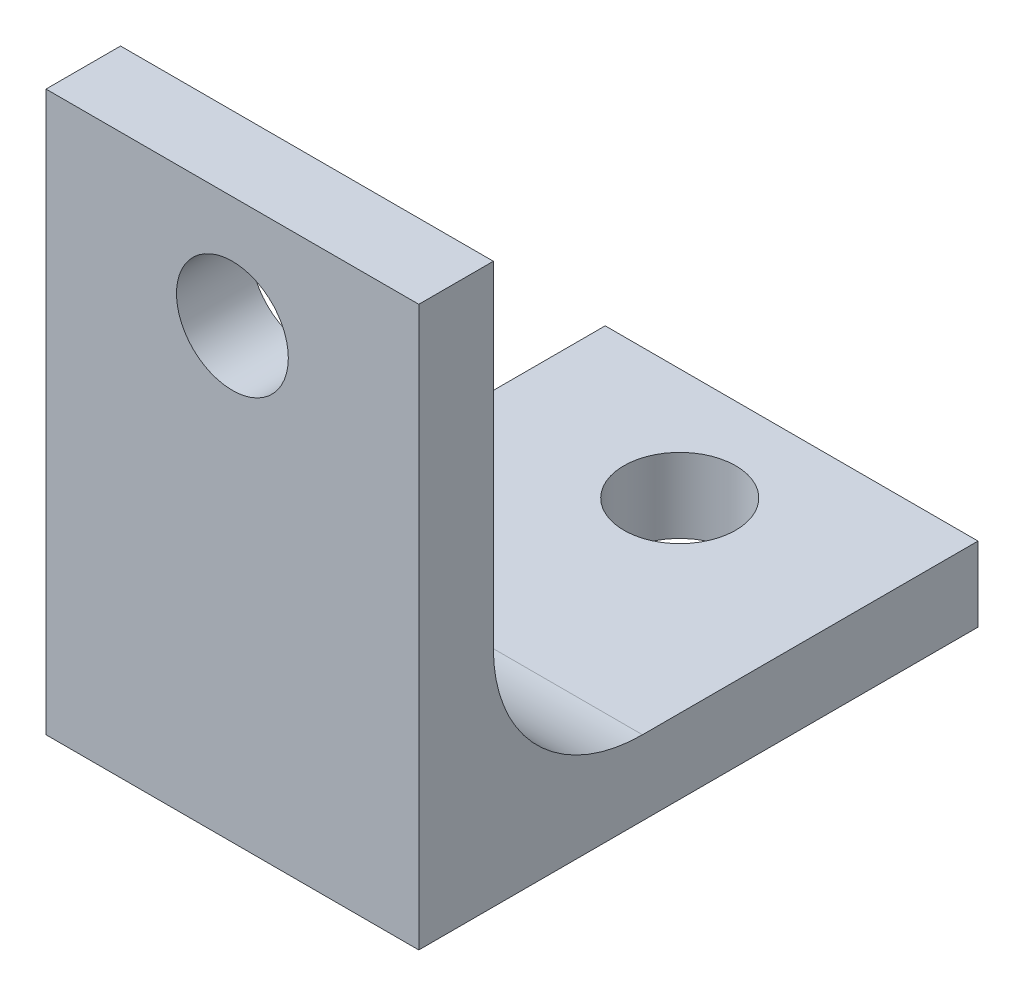
ISO-10303-21;
HEADER;
FILE_DESCRIPTION(('STEP AP214'),'2;1');
FILE_NAME('part.step','',(''),(''),'','','');
FILE_SCHEMA(('AUTOMOTIVE_DESIGN { 1 0 10303 214 1 1 1 1 }'));
ENDSEC;
DATA;
#1=APPLICATION_CONTEXT('core data for automotive mechanical design processes');
#2=APPLICATION_PROTOCOL_DEFINITION('international standard','automotive_design',2000,#1);
#3=PRODUCT_CONTEXT('',#1,'mechanical');
#4=PRODUCT('Part','Part','',(#3));
#5=PRODUCT_RELATED_PRODUCT_CATEGORY('part','',(#4));
#6=PRODUCT_DEFINITION_FORMATION('','',#4);
#7=PRODUCT_DEFINITION_CONTEXT('part definition',#1,'design');
#8=PRODUCT_DEFINITION('design','',#6,#7);
#9=PRODUCT_DEFINITION_SHAPE('','',#8);
#10=(LENGTH_UNIT() NAMED_UNIT(*) SI_UNIT(.MILLI.,.METRE.));
#11=(NAMED_UNIT(*) PLANE_ANGLE_UNIT() SI_UNIT($,.RADIAN.));
#12=(NAMED_UNIT(*) SI_UNIT($,.STERADIAN.) SOLID_ANGLE_UNIT());
#13=UNCERTAINTY_MEASURE_WITH_UNIT(LENGTH_MEASURE(1.E-05),#10,'distance_accuracy_value','');
#14=(GEOMETRIC_REPRESENTATION_CONTEXT(3) GLOBAL_UNCERTAINTY_ASSIGNED_CONTEXT((#13)) GLOBAL_UNIT_ASSIGNED_CONTEXT((#10,
#11,#12)) REPRESENTATION_CONTEXT('',''));
#15=CARTESIAN_POINT('',(0.,0.,0.));
#16=DIRECTION('',(0.,0.,1.));
#17=DIRECTION('',(1.,0.,0.));
#18=AXIS2_PLACEMENT_3D('',#15,#16,#17);
#19=CARTESIAN_POINT('',(10.,0.,-15.));
#20=DIRECTION('',(0.,1.,0.));
#21=DIRECTION('',(0.,0.,-1.));
#22=AXIS2_PLACEMENT_3D('',#19,#20,#21);
#23=PLANE('',#22);
#24=CARTESIAN_POINT('',(5.,0.,-12.));
#25=DIRECTION('',(0.,-1.,0.));
#26=DIRECTION('',(0.,0.,-1.));
#27=AXIS2_PLACEMENT_3D('',#24,#25,#26);
#28=CIRCLE('',#27,1.5);
#29=CARTESIAN_POINT('',(5.,0.,-13.5));
#30=VERTEX_POINT('',#29);
#31=EDGE_CURVE('E259',#30,#30,#28,.T.);
#32=ORIENTED_EDGE('',*,*,#31,.F.);
#33=EDGE_LOOP('',(#32));
#34=FACE_BOUND('',#33,.T.);
#35=DIRECTION('',(0.,0.,1.));
#36=VECTOR('',#35,1.);
#37=CARTESIAN_POINT('',(0.,0.,-15.));
#38=LINE('',#37,#36);
#39=CARTESIAN_POINT('',(0.,0.,-15.));
#40=VERTEX_POINT('',#39);
#41=CARTESIAN_POINT('',(0.,0.,0.));
#42=VERTEX_POINT('',#41);
#43=EDGE_CURVE('E134',#40,#42,#38,.T.);
#44=ORIENTED_EDGE('',*,*,#43,.F.);
#45=DIRECTION('',(-1.,0.,0.));
#46=VECTOR('',#45,1.);
#47=CARTESIAN_POINT('',(10.,0.,-15.));
#48=LINE('',#47,#46);
#49=CARTESIAN_POINT('',(10.,0.,-15.));
#50=VERTEX_POINT('',#49);
#51=EDGE_CURVE('E116',#50,#40,#48,.T.);
#52=ORIENTED_EDGE('',*,*,#51,.F.);
#53=DIRECTION('',(0.,0.,1.));
#54=VECTOR('',#53,1.);
#55=CARTESIAN_POINT('',(10.,0.,-15.));
#56=LINE('',#55,#54);
#57=CARTESIAN_POINT('',(10.,0.,0.));
#58=VERTEX_POINT('',#57);
#59=EDGE_CURVE('E96',#50,#58,#56,.T.);
#60=ORIENTED_EDGE('',*,*,#59,.T.);
#61=DIRECTION('',(-1.,0.,0.));
#62=VECTOR('',#61,1.);
#63=CARTESIAN_POINT('',(10.,0.,0.));
#64=LINE('',#63,#62);
#65=EDGE_CURVE('E105',#58,#42,#64,.T.);
#66=ORIENTED_EDGE('',*,*,#65,.T.);
#67=EDGE_LOOP('',(#44,#52,#60,#66));
#68=FACE_BOUND('',#67,.T.);
#69=ADVANCED_FACE('F37',(#34,#68),#23,.F.);
#70=CARTESIAN_POINT('',(10.,0.,0.));
#71=DIRECTION('',(0.,0.,-1.));
#72=DIRECTION('',(1.,0.,0.));
#73=AXIS2_PLACEMENT_3D('',#70,#71,#72);
#74=PLANE('',#73);
#75=CARTESIAN_POINT('',(5.,12.,0.));
#76=DIRECTION('',(0.,0.,1.));
#77=DIRECTION('',(1.,0.,0.));
#78=AXIS2_PLACEMENT_3D('',#75,#76,#77);
#79=CIRCLE('',#78,1.5);
#80=CARTESIAN_POINT('',(6.5,12.,0.));
#81=VERTEX_POINT('',#80);
#82=EDGE_CURVE('E122',#81,#81,#79,.T.);
#83=ORIENTED_EDGE('',*,*,#82,.F.);
#84=EDGE_LOOP('',(#83));
#85=FACE_BOUND('',#84,.T.);
#86=DIRECTION('',(0.,1.,0.));
#87=VECTOR('',#86,1.);
#88=CARTESIAN_POINT('',(0.,0.,0.));
#89=LINE('',#88,#87);
#90=CARTESIAN_POINT('',(0.,15.,0.));
#91=VERTEX_POINT('',#90);
#92=EDGE_CURVE('E108',#42,#91,#89,.T.);
#93=ORIENTED_EDGE('',*,*,#92,.F.);
#94=ORIENTED_EDGE('',*,*,#65,.F.);
#95=DIRECTION('',(0.,1.,0.));
#96=VECTOR('',#95,1.);
#97=CARTESIAN_POINT('',(10.,0.,0.));
#98=LINE('',#97,#96);
#99=CARTESIAN_POINT('',(10.,15.,0.));
#100=VERTEX_POINT('',#99);
#101=EDGE_CURVE('E92',#58,#100,#98,.T.);
#102=ORIENTED_EDGE('',*,*,#101,.T.);
#103=DIRECTION('',(-1.,0.,0.));
#104=VECTOR('',#103,1.);
#105=CARTESIAN_POINT('',(10.,15.,0.));
#106=LINE('',#105,#104);
#107=EDGE_CURVE('E113',#100,#91,#106,.T.);
#108=ORIENTED_EDGE('',*,*,#107,.T.);
#109=EDGE_LOOP('',(#93,#94,#102,#108));
#110=FACE_BOUND('',#109,.T.);
#111=ADVANCED_FACE('F106',(#85,#110),#74,.F.);
#112=CARTESIAN_POINT('',(10.,15.,0.));
#113=DIRECTION('',(0.,-1.,0.));
#114=DIRECTION('',(0.,0.,1.));
#115=AXIS2_PLACEMENT_3D('',#112,#113,#114);
#116=PLANE('',#115);
#117=DIRECTION('',(0.,0.,-1.));
#118=VECTOR('',#117,1.);
#119=CARTESIAN_POINT('',(0.,15.,0.));
#120=LINE('',#119,#118);
#121=CARTESIAN_POINT('',(0.,15.,-2.));
#122=VERTEX_POINT('',#121);
#123=EDGE_CURVE('E137',#91,#122,#120,.T.);
#124=ORIENTED_EDGE('',*,*,#123,.F.);
#125=ORIENTED_EDGE('',*,*,#107,.F.);
#126=DIRECTION('',(0.,0.,-1.));
#127=VECTOR('',#126,1.);
#128=CARTESIAN_POINT('',(10.,15.,0.));
#129=LINE('',#128,#127);
#130=CARTESIAN_POINT('',(10.,15.,-2.));
#131=VERTEX_POINT('',#130);
#132=EDGE_CURVE('E99',#100,#131,#129,.T.);
#133=ORIENTED_EDGE('',*,*,#132,.T.);
#134=DIRECTION('',(-1.,0.,0.));
#135=VECTOR('',#134,1.);
#136=CARTESIAN_POINT('',(10.,15.,-2.));
#137=LINE('',#136,#135);
#138=EDGE_CURVE('E149',#131,#122,#137,.T.);
#139=ORIENTED_EDGE('',*,*,#138,.T.);
#140=EDGE_LOOP('',(#124,#125,#133,#139));
#141=FACE_BOUND('',#140,.T.);
#142=ADVANCED_FACE('F160',(#141),#116,.F.);
#143=CARTESIAN_POINT('',(10.,15.,-2.));
#144=DIRECTION('',(0.,0.,1.));
#145=DIRECTION('',(0.,1.,0.));
#146=AXIS2_PLACEMENT_3D('',#143,#144,#145);
#147=PLANE('',#146);
#148=CARTESIAN_POINT('',(5.,12.,-2.));
#149=DIRECTION('',(0.,0.,1.));
#150=DIRECTION('',(1.,0.,0.));
#151=AXIS2_PLACEMENT_3D('',#148,#149,#150);
#152=CIRCLE('',#151,1.5);
#153=CARTESIAN_POINT('',(6.5,12.,-2.));
#154=VERTEX_POINT('',#153);
#155=EDGE_CURVE('E260',#154,#154,#152,.T.);
#156=ORIENTED_EDGE('',*,*,#155,.T.);
#157=EDGE_LOOP('',(#156));
#158=FACE_BOUND('',#157,.T.);
#159=DIRECTION('',(0.,-1.,0.));
#160=VECTOR('',#159,1.);
#161=CARTESIAN_POINT('',(0.,15.,-2.));
#162=LINE('',#161,#160);
#163=CARTESIAN_POINT('',(0.,6.,-2.));
#164=VERTEX_POINT('',#163);
#165=EDGE_CURVE('E140',#122,#164,#162,.T.);
#166=ORIENTED_EDGE('',*,*,#165,.F.);
#167=ORIENTED_EDGE('',*,*,#138,.F.);
#168=DIRECTION('',(0.,-1.,0.));
#169=VECTOR('',#168,1.);
#170=CARTESIAN_POINT('',(10.,15.,-2.));
#171=LINE('',#170,#169);
#172=CARTESIAN_POINT('',(10.,6.,-2.));
#173=VERTEX_POINT('',#172);
#174=EDGE_CURVE('E126',#131,#173,#171,.T.);
#175=ORIENTED_EDGE('',*,*,#174,.T.);
#176=DIRECTION('',(-1.,0.,0.));
#177=VECTOR('',#176,1.);
#178=CARTESIAN_POINT('',(10.,6.,-2.));
#179=LINE('',#178,#177);
#180=EDGE_CURVE('E154',#164,#173,#179,.F.);
#181=ORIENTED_EDGE('',*,*,#180,.F.);
#182=EDGE_LOOP('',(#166,#167,#175,#181));
#183=FACE_BOUND('',#182,.T.);
#184=ADVANCED_FACE('F158',(#158,#183),#147,.F.);
#185=CARTESIAN_POINT('',(10.,2.,-2.));
#186=DIRECTION('',(0.,-1.,0.));
#187=DIRECTION('',(0.,0.,1.));
#188=AXIS2_PLACEMENT_3D('',#185,#186,#187);
#189=PLANE('',#188);
#190=CARTESIAN_POINT('',(5.,2.,-12.));
#191=DIRECTION('',(0.,-1.,0.));
#192=DIRECTION('',(0.,0.,-1.));
#193=AXIS2_PLACEMENT_3D('',#190,#191,#192);
#194=CIRCLE('',#193,1.5);
#195=CARTESIAN_POINT('',(5.,2.,-13.5));
#196=VERTEX_POINT('',#195);
#197=EDGE_CURVE('E257',#196,#196,#194,.T.);
#198=ORIENTED_EDGE('',*,*,#197,.T.);
#199=EDGE_LOOP('',(#198));
#200=FACE_BOUND('',#199,.T.);
#201=DIRECTION('',(0.,0.,-1.));
#202=VECTOR('',#201,1.);
#203=CARTESIAN_POINT('',(10.,2.,-2.));
#204=LINE('',#203,#202);
#205=CARTESIAN_POINT('',(10.,2.,-6.));
#206=VERTEX_POINT('',#205);
#207=CARTESIAN_POINT('',(10.,2.,-15.));
#208=VERTEX_POINT('',#207);
#209=EDGE_CURVE('E129',#206,#208,#204,.T.);
#210=ORIENTED_EDGE('',*,*,#209,.T.);
#211=DIRECTION('',(-1.,0.,0.));
#212=VECTOR('',#211,1.);
#213=CARTESIAN_POINT('',(10.,2.,-15.));
#214=LINE('',#213,#212);
#215=CARTESIAN_POINT('',(0.,2.,-15.));
#216=VERTEX_POINT('',#215);
#217=EDGE_CURVE('E146',#208,#216,#214,.T.);
#218=ORIENTED_EDGE('',*,*,#217,.T.);
#219=DIRECTION('',(0.,0.,-1.));
#220=VECTOR('',#219,1.);
#221=CARTESIAN_POINT('',(0.,2.,-2.));
#222=LINE('',#221,#220);
#223=CARTESIAN_POINT('',(0.,2.,-6.));
#224=VERTEX_POINT('',#223);
#225=EDGE_CURVE('E119',#224,#216,#222,.T.);
#226=ORIENTED_EDGE('',*,*,#225,.F.);
#227=DIRECTION('',(-1.,0.,0.));
#228=VECTOR('',#227,1.);
#229=CARTESIAN_POINT('',(0.,2.,-6.));
#230=LINE('',#229,#228);
#231=EDGE_CURVE('E112',#206,#224,#230,.T.);
#232=ORIENTED_EDGE('',*,*,#231,.F.);
#233=EDGE_LOOP('',(#210,#218,#226,#232));
#234=FACE_BOUND('',#233,.T.);
#235=ADVANCED_FACE('F168',(#200,#234),#189,.F.);
#236=CARTESIAN_POINT('',(10.,2.,-15.));
#237=DIRECTION('',(0.,0.,1.));
#238=DIRECTION('',(-1.,0.,0.));
#239=AXIS2_PLACEMENT_3D('',#236,#237,#238);
#240=PLANE('',#239);
#241=DIRECTION('',(0.,-1.,0.));
#242=VECTOR('',#241,1.);
#243=CARTESIAN_POINT('',(0.,2.,-15.));
#244=LINE('',#243,#242);
#245=EDGE_CURVE('E117',#216,#40,#244,.T.);
#246=ORIENTED_EDGE('',*,*,#245,.F.);
#247=ORIENTED_EDGE('',*,*,#217,.F.);
#248=DIRECTION('',(0.,-1.,0.));
#249=VECTOR('',#248,1.);
#250=CARTESIAN_POINT('',(10.,2.,-15.));
#251=LINE('',#250,#249);
#252=EDGE_CURVE('E132',#208,#50,#251,.T.);
#253=ORIENTED_EDGE('',*,*,#252,.T.);
#254=ORIENTED_EDGE('',*,*,#51,.T.);
#255=EDGE_LOOP('',(#246,#247,#253,#254));
#256=FACE_BOUND('',#255,.T.);
#257=ADVANCED_FACE('F166',(#256),#240,.F.);
#258=CARTESIAN_POINT('',(10.,0.,0.));
#259=DIRECTION('',(1.,0.,0.));
#260=DIRECTION('',(0.,0.,1.));
#261=AXIS2_PLACEMENT_3D('',#258,#259,#260);
#262=PLANE('',#261);
#263=ORIENTED_EDGE('',*,*,#59,.F.);
#264=ORIENTED_EDGE('',*,*,#252,.F.);
#265=ORIENTED_EDGE('',*,*,#209,.F.);
#266=CARTESIAN_POINT('',(10.,6.,-6.));
#267=DIRECTION('',(-1.,0.,0.));
#268=DIRECTION('',(0.,0.,1.));
#269=AXIS2_PLACEMENT_3D('',#266,#267,#268);
#270=CIRCLE('',#269,4.);
#271=EDGE_CURVE('E11',#173,#206,#270,.F.);
#272=ORIENTED_EDGE('',*,*,#271,.F.);
#273=ORIENTED_EDGE('',*,*,#174,.F.);
#274=ORIENTED_EDGE('',*,*,#132,.F.);
#275=ORIENTED_EDGE('',*,*,#101,.F.);
#276=EDGE_LOOP('',(#263,#264,#265,#272,#273,#274,#275));
#277=FACE_BOUND('',#276,.T.);
#278=ADVANCED_FACE('F94',(#277),#262,.T.);
#279=CARTESIAN_POINT('',(0.,0.,0.));
#280=DIRECTION('',(1.,0.,0.));
#281=DIRECTION('',(0.,0.,1.));
#282=AXIS2_PLACEMENT_3D('',#279,#280,#281);
#283=PLANE('',#282);
#284=ORIENTED_EDGE('',*,*,#43,.T.);
#285=ORIENTED_EDGE('',*,*,#92,.T.);
#286=ORIENTED_EDGE('',*,*,#123,.T.);
#287=ORIENTED_EDGE('',*,*,#165,.T.);
#288=CARTESIAN_POINT('',(0.,6.,-6.));
#289=DIRECTION('',(-1.,0.,0.));
#290=DIRECTION('',(0.,0.,1.));
#291=AXIS2_PLACEMENT_3D('',#288,#289,#290);
#292=CIRCLE('',#291,4.);
#293=EDGE_CURVE('E45',#224,#164,#292,.T.);
#294=ORIENTED_EDGE('',*,*,#293,.F.);
#295=ORIENTED_EDGE('',*,*,#225,.T.);
#296=ORIENTED_EDGE('',*,*,#245,.T.);
#297=EDGE_LOOP('',(#284,#285,#286,#287,#294,#295,#296));
#298=FACE_BOUND('',#297,.T.);
#299=ADVANCED_FACE('F162',(#298),#283,.F.);
#300=CARTESIAN_POINT('',(5.,12.,8.));
#301=DIRECTION('',(0.,0.,-1.));
#302=DIRECTION('',(1.,0.,0.));
#303=AXIS2_PLACEMENT_3D('',#300,#301,#302);
#304=CYLINDRICAL_SURFACE('',#303,1.5);
#305=ORIENTED_EDGE('',*,*,#155,.F.);
#306=EDGE_LOOP('',(#305));
#307=FACE_BOUND('',#306,.T.);
#308=ORIENTED_EDGE('',*,*,#82,.T.);
#309=EDGE_LOOP('',(#308));
#310=FACE_BOUND('',#309,.T.);
#311=ADVANCED_FACE('F225',(#307,#310),#304,.F.);
#312=CARTESIAN_POINT('',(5.,-8.,-12.));
#313=DIRECTION('',(0.,1.,0.));
#314=DIRECTION('',(0.,0.,-1.));
#315=AXIS2_PLACEMENT_3D('',#312,#313,#314);
#316=CYLINDRICAL_SURFACE('',#315,1.5);
#317=ORIENTED_EDGE('',*,*,#197,.F.);
#318=EDGE_LOOP('',(#317));
#319=FACE_BOUND('',#318,.T.);
#320=ORIENTED_EDGE('',*,*,#31,.T.);
#321=EDGE_LOOP('',(#320));
#322=FACE_BOUND('',#321,.T.);
#323=ADVANCED_FACE('F234',(#319,#322),#316,.F.);
#324=CARTESIAN_POINT('',(10.,6.,-6.));
#325=DIRECTION('',(1.,0.,0.));
#326=DIRECTION('',(0.,0.,1.));
#327=AXIS2_PLACEMENT_3D('',#324,#325,#326);
#328=CYLINDRICAL_SURFACE('',#327,4.);
#329=ORIENTED_EDGE('',*,*,#271,.T.);
#330=ORIENTED_EDGE('',*,*,#231,.T.);
#331=ORIENTED_EDGE('',*,*,#293,.T.);
#332=ORIENTED_EDGE('',*,*,#180,.T.);
#333=EDGE_LOOP('',(#329,#330,#331,#332));
#334=FACE_BOUND('',#333,.T.);
#335=ADVANCED_FACE('F39',(#334),#328,.F.);
#336=CLOSED_SHELL('',(#69,#111,#142,#184,#235,#257,#278,#299,#311,#323,#335));
#337=MANIFOLD_SOLID_BREP('B2',#336);
#338=ADVANCED_BREP_SHAPE_REPRESENTATION('',(#18,#337),#14);
#339=SHAPE_DEFINITION_REPRESENTATION(#9,#338);
ENDSEC;
END-ISO-10303-21;
